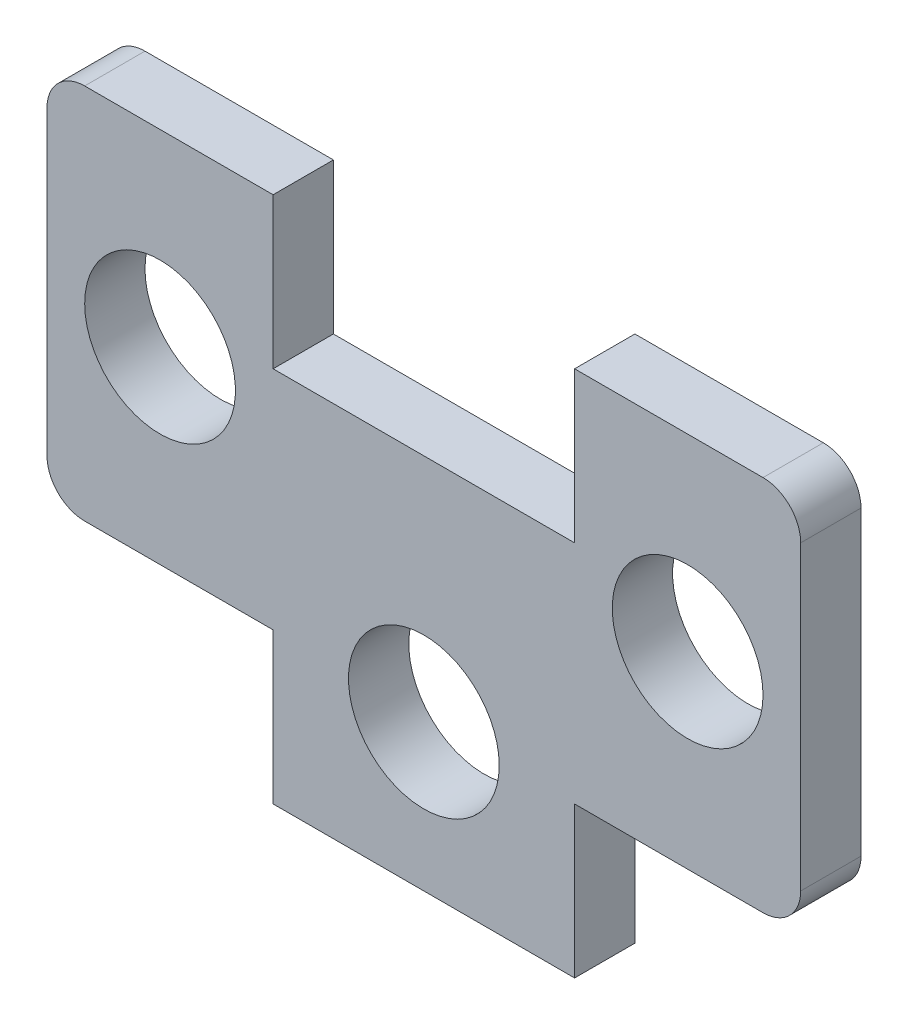
ISO-10303-21;
HEADER;
FILE_DESCRIPTION(('STEP AP214'),'2;1');
FILE_NAME('part.step','',(''),(''),'','','');
FILE_SCHEMA(('AUTOMOTIVE_DESIGN { 1 0 10303 214 1 1 1 1 }'));
ENDSEC;
DATA;
#1=APPLICATION_CONTEXT('core data for automotive mechanical design processes');
#2=APPLICATION_PROTOCOL_DEFINITION('international standard','automotive_design',2000,#1);
#3=PRODUCT_CONTEXT('',#1,'mechanical');
#4=PRODUCT('Part','Part','',(#3));
#5=PRODUCT_RELATED_PRODUCT_CATEGORY('part','',(#4));
#6=PRODUCT_DEFINITION_FORMATION('','',#4);
#7=PRODUCT_DEFINITION_CONTEXT('part definition',#1,'design');
#8=PRODUCT_DEFINITION('design','',#6,#7);
#9=PRODUCT_DEFINITION_SHAPE('','',#8);
#10=(LENGTH_UNIT() NAMED_UNIT(*) SI_UNIT(.MILLI.,.METRE.));
#11=(NAMED_UNIT(*) PLANE_ANGLE_UNIT() SI_UNIT($,.RADIAN.));
#12=(NAMED_UNIT(*) SI_UNIT($,.STERADIAN.) SOLID_ANGLE_UNIT());
#13=UNCERTAINTY_MEASURE_WITH_UNIT(LENGTH_MEASURE(1.E-05),#10,'distance_accuracy_value','');
#14=(GEOMETRIC_REPRESENTATION_CONTEXT(3) GLOBAL_UNCERTAINTY_ASSIGNED_CONTEXT((#13)) GLOBAL_UNIT_ASSIGNED_CONTEXT((#10,
#11,#12)) REPRESENTATION_CONTEXT('',''));
#15=CARTESIAN_POINT('',(0.,0.,0.));
#16=DIRECTION('',(0.,0.,1.));
#17=DIRECTION('',(1.,0.,0.));
#18=AXIS2_PLACEMENT_3D('',#15,#16,#17);
#19=CARTESIAN_POINT('',(225.,-97.0944917097693,40.));
#20=DIRECTION('',(0.,0.,-1.));
#21=DIRECTION('',(-1.,0.,0.));
#22=AXIS2_PLACEMENT_3D('',#19,#20,#21);
#23=PLANE('',#22);
#24=DIRECTION('',(1.,0.,0.));
#25=VECTOR('',#24,1.);
#26=CARTESIAN_POINT('',(-225.,-122.094491709769,40.));
#27=LINE('',#26,#25);
#28=CARTESIAN_POINT('',(-225.,-122.094491709769,40.));
#29=VERTEX_POINT('',#28);
#30=CARTESIAN_POINT('',(-100.,-122.094491709769,40.));
#31=VERTEX_POINT('',#30);
#32=EDGE_CURVE('E209',#29,#31,#27,.T.);
#33=ORIENTED_EDGE('',*,*,#32,.T.);
#34=DIRECTION('',(0.,-1.,0.));
#35=VECTOR('',#34,1.);
#36=CARTESIAN_POINT('',(-100.,-122.094491709769,40.));
#37=LINE('',#36,#35);
#38=CARTESIAN_POINT('',(-100.,-222.094491709769,40.));
#39=VERTEX_POINT('',#38);
#40=EDGE_CURVE('E117',#31,#39,#37,.T.);
#41=ORIENTED_EDGE('',*,*,#40,.T.);
#42=DIRECTION('',(1.,0.,0.));
#43=VECTOR('',#42,1.);
#44=CARTESIAN_POINT('',(-100.,-222.094491709769,40.));
#45=LINE('',#44,#43);
#46=CARTESIAN_POINT('',(99.9999999999999,-222.094491709769,40.));
#47=VERTEX_POINT('',#46);
#48=EDGE_CURVE('E248',#39,#47,#45,.T.);
#49=ORIENTED_EDGE('',*,*,#48,.T.);
#50=DIRECTION('',(0.,1.,0.));
#51=VECTOR('',#50,1.);
#52=CARTESIAN_POINT('',(99.9999999999999,-222.094491709769,40.));
#53=LINE('',#52,#51);
#54=CARTESIAN_POINT('',(99.9999999999999,-122.094491709769,40.));
#55=VERTEX_POINT('',#54);
#56=EDGE_CURVE('E267',#47,#55,#53,.T.);
#57=ORIENTED_EDGE('',*,*,#56,.T.);
#58=DIRECTION('',(1.,0.,0.));
#59=VECTOR('',#58,1.);
#60=CARTESIAN_POINT('',(99.9999999999999,-122.094491709769,40.));
#61=LINE('',#60,#59);
#62=CARTESIAN_POINT('',(225.,-122.094491709769,40.));
#63=VERTEX_POINT('',#62);
#64=EDGE_CURVE('E264',#55,#63,#61,.T.);
#65=ORIENTED_EDGE('',*,*,#64,.T.);
#66=CARTESIAN_POINT('',(225.,-97.0944917097693,40.));
#67=DIRECTION('',(0.,0.,1.));
#68=DIRECTION('',(-1.,0.,0.));
#69=AXIS2_PLACEMENT_3D('',#66,#67,#68);
#70=CIRCLE('',#69,25.);
#71=CARTESIAN_POINT('',(250.,-97.0944917097693,40.));
#72=VERTEX_POINT('',#71);
#73=EDGE_CURVE('E266',#63,#72,#70,.T.);
#74=ORIENTED_EDGE('',*,*,#73,.T.);
#75=DIRECTION('',(0.,1.,0.));
#76=VECTOR('',#75,1.);
#77=CARTESIAN_POINT('',(250.,-97.0944917097693,40.));
#78=LINE('',#77,#76);
#79=CARTESIAN_POINT('',(250.,102.905508290231,40.));
#80=VERTEX_POINT('',#79);
#81=EDGE_CURVE('E269',#72,#80,#78,.T.);
#82=ORIENTED_EDGE('',*,*,#81,.T.);
#83=CARTESIAN_POINT('',(225.,102.905508290231,40.));
#84=DIRECTION('',(0.,0.,1.));
#85=DIRECTION('',(1.,0.,0.));
#86=AXIS2_PLACEMENT_3D('',#83,#84,#85);
#87=CIRCLE('',#86,25.);
#88=CARTESIAN_POINT('',(225.,127.905508290231,40.));
#89=VERTEX_POINT('',#88);
#90=EDGE_CURVE('E275',#80,#89,#87,.T.);
#91=ORIENTED_EDGE('',*,*,#90,.T.);
#92=DIRECTION('',(-1.,0.,0.));
#93=VECTOR('',#92,1.);
#94=CARTESIAN_POINT('',(99.9999999999999,127.905508290231,40.));
#95=LINE('',#94,#93);
#96=CARTESIAN_POINT('',(99.9999999999999,127.905508290231,40.));
#97=VERTEX_POINT('',#96);
#98=EDGE_CURVE('E277',#89,#97,#95,.T.);
#99=ORIENTED_EDGE('',*,*,#98,.T.);
#100=DIRECTION('',(0.,-1.,0.));
#101=VECTOR('',#100,1.);
#102=CARTESIAN_POINT('',(100.,27.9055082902306,40.));
#103=LINE('',#102,#101);
#104=CARTESIAN_POINT('',(100.,27.9055082902306,40.));
#105=VERTEX_POINT('',#104);
#106=EDGE_CURVE('E279',#97,#105,#103,.T.);
#107=ORIENTED_EDGE('',*,*,#106,.T.);
#108=DIRECTION('',(-1.,0.,0.));
#109=VECTOR('',#108,1.);
#110=CARTESIAN_POINT('',(-100.,27.9055082902306,40.));
#111=LINE('',#110,#109);
#112=CARTESIAN_POINT('',(-100.,27.9055082902306,40.));
#113=VERTEX_POINT('',#112);
#114=EDGE_CURVE('E281',#105,#113,#111,.T.);
#115=ORIENTED_EDGE('',*,*,#114,.T.);
#116=DIRECTION('',(0.,1.,0.));
#117=VECTOR('',#116,1.);
#118=CARTESIAN_POINT('',(-100.,127.905508290231,40.));
#119=LINE('',#118,#117);
#120=CARTESIAN_POINT('',(-100.,127.905508290231,40.));
#121=VERTEX_POINT('',#120);
#122=EDGE_CURVE('E283',#113,#121,#119,.T.);
#123=ORIENTED_EDGE('',*,*,#122,.T.);
#124=DIRECTION('',(-1.,0.,0.));
#125=VECTOR('',#124,1.);
#126=CARTESIAN_POINT('',(-225.,127.905508290231,40.));
#127=LINE('',#126,#125);
#128=CARTESIAN_POINT('',(-225.,127.905508290231,40.));
#129=VERTEX_POINT('',#128);
#130=EDGE_CURVE('E160',#121,#129,#127,.T.);
#131=ORIENTED_EDGE('',*,*,#130,.T.);
#132=CARTESIAN_POINT('',(-225.,102.905508290231,40.));
#133=DIRECTION('',(0.,0.,1.));
#134=DIRECTION('',(-1.,0.,0.));
#135=AXIS2_PLACEMENT_3D('',#132,#133,#134);
#136=CIRCLE('',#135,25.);
#137=CARTESIAN_POINT('',(-250.,102.905508290231,40.));
#138=VERTEX_POINT('',#137);
#139=EDGE_CURVE('E154',#129,#138,#136,.T.);
#140=ORIENTED_EDGE('',*,*,#139,.T.);
#141=DIRECTION('',(0.,-1.,0.));
#142=VECTOR('',#141,1.);
#143=CARTESIAN_POINT('',(-250.,-97.0944917097693,40.));
#144=LINE('',#143,#142);
#145=CARTESIAN_POINT('',(-250.,-97.0944917097693,40.));
#146=VERTEX_POINT('',#145);
#147=EDGE_CURVE('E158',#138,#146,#144,.T.);
#148=ORIENTED_EDGE('',*,*,#147,.T.);
#149=CARTESIAN_POINT('',(-225.,-97.0944917097693,40.));
#150=DIRECTION('',(0.,0.,1.));
#151=DIRECTION('',(-1.,0.,0.));
#152=AXIS2_PLACEMENT_3D('',#149,#150,#151);
#153=CIRCLE('',#152,25.);
#154=EDGE_CURVE('E50',#146,#29,#153,.T.);
#155=ORIENTED_EDGE('',*,*,#154,.T.);
#156=EDGE_LOOP('',(#33,#41,#49,#57,#65,#74,#82,#91,#99,#107,#115,#123,#131,#140,#148,#155));
#157=FACE_BOUND('',#156,.T.);
#158=CARTESIAN_POINT('',(0.,-125.,40.));
#159=DIRECTION('',(0.,0.,1.));
#160=DIRECTION('',(1.,0.,0.));
#161=AXIS2_PLACEMENT_3D('',#158,#159,#160);
#162=CIRCLE('',#161,50.);
#163=CARTESIAN_POINT('',(50.,-125.,40.));
#164=VERTEX_POINT('',#163);
#165=EDGE_CURVE('E182',#164,#164,#162,.T.);
#166=ORIENTED_EDGE('',*,*,#165,.F.);
#167=EDGE_LOOP('',(#166));
#168=FACE_BOUND('',#167,.T.);
#169=CARTESIAN_POINT('',(175.,2.90550829023069,40.));
#170=DIRECTION('',(0.,0.,1.));
#171=DIRECTION('',(1.,0.,0.));
#172=AXIS2_PLACEMENT_3D('',#169,#170,#171);
#173=CIRCLE('',#172,50.);
#174=CARTESIAN_POINT('',(225.,2.90550829023069,40.));
#175=VERTEX_POINT('',#174);
#176=EDGE_CURVE('E337',#175,#175,#173,.T.);
#177=ORIENTED_EDGE('',*,*,#176,.F.);
#178=EDGE_LOOP('',(#177));
#179=FACE_BOUND('',#178,.T.);
#180=CARTESIAN_POINT('',(-175.,2.90550829023069,40.));
#181=DIRECTION('',(0.,0.,1.));
#182=DIRECTION('',(-1.,0.,0.));
#183=AXIS2_PLACEMENT_3D('',#180,#181,#182);
#184=CIRCLE('',#183,50.);
#185=CARTESIAN_POINT('',(-225.,2.90550829023069,40.));
#186=VERTEX_POINT('',#185);
#187=EDGE_CURVE('E328',#186,#186,#184,.T.);
#188=ORIENTED_EDGE('',*,*,#187,.F.);
#189=EDGE_LOOP('',(#188));
#190=FACE_BOUND('',#189,.T.);
#191=ADVANCED_FACE('F33',(#157,#168,#179,#190),#23,.F.);
#192=CARTESIAN_POINT('',(225.,-97.0944917097693,0.));
#193=DIRECTION('',(0.,0.,-1.));
#194=DIRECTION('',(-1.,0.,0.));
#195=AXIS2_PLACEMENT_3D('',#192,#193,#194);
#196=PLANE('',#195);
#197=CARTESIAN_POINT('',(175.,2.90550829023069,0.));
#198=DIRECTION('',(0.,0.,1.));
#199=DIRECTION('',(1.,0.,0.));
#200=AXIS2_PLACEMENT_3D('',#197,#198,#199);
#201=CIRCLE('',#200,50.);
#202=CARTESIAN_POINT('',(225.,2.90550829023069,0.));
#203=VERTEX_POINT('',#202);
#204=EDGE_CURVE('E334',#203,#203,#201,.T.);
#205=ORIENTED_EDGE('',*,*,#204,.T.);
#206=EDGE_LOOP('',(#205));
#207=FACE_BOUND('',#206,.T.);
#208=DIRECTION('',(1.,0.,0.));
#209=VECTOR('',#208,1.);
#210=CARTESIAN_POINT('',(-225.,-122.094491709769,0.));
#211=LINE('',#210,#209);
#212=CARTESIAN_POINT('',(-225.,-122.094491709769,0.));
#213=VERTEX_POINT('',#212);
#214=CARTESIAN_POINT('',(-100.,-122.094491709769,0.));
#215=VERTEX_POINT('',#214);
#216=EDGE_CURVE('E178',#213,#215,#211,.T.);
#217=ORIENTED_EDGE('',*,*,#216,.F.);
#218=CARTESIAN_POINT('',(-225.,-97.0944917097693,0.));
#219=DIRECTION('',(0.,0.,1.));
#220=DIRECTION('',(-1.,0.,0.));
#221=AXIS2_PLACEMENT_3D('',#218,#219,#220);
#222=CIRCLE('',#221,25.);
#223=CARTESIAN_POINT('',(-250.,-97.0944917097693,0.));
#224=VERTEX_POINT('',#223);
#225=EDGE_CURVE('E109',#224,#213,#222,.T.);
#226=ORIENTED_EDGE('',*,*,#225,.F.);
#227=DIRECTION('',(0.,-1.,0.));
#228=VECTOR('',#227,1.);
#229=CARTESIAN_POINT('',(-250.,-97.0944917097693,0.));
#230=LINE('',#229,#228);
#231=CARTESIAN_POINT('',(-250.,102.905508290231,0.));
#232=VERTEX_POINT('',#231);
#233=EDGE_CURVE('E103',#232,#224,#230,.T.);
#234=ORIENTED_EDGE('',*,*,#233,.F.);
#235=CARTESIAN_POINT('',(-225.,102.905508290231,0.));
#236=DIRECTION('',(0.,0.,1.));
#237=DIRECTION('',(-1.,0.,0.));
#238=AXIS2_PLACEMENT_3D('',#235,#236,#237);
#239=CIRCLE('',#238,25.);
#240=CARTESIAN_POINT('',(-225.,127.905508290231,0.));
#241=VERTEX_POINT('',#240);
#242=EDGE_CURVE('E168',#241,#232,#239,.T.);
#243=ORIENTED_EDGE('',*,*,#242,.F.);
#244=DIRECTION('',(-1.,0.,0.));
#245=VECTOR('',#244,1.);
#246=CARTESIAN_POINT('',(-225.,127.905508290231,0.));
#247=LINE('',#246,#245);
#248=CARTESIAN_POINT('',(-100.,127.905508290231,0.));
#249=VERTEX_POINT('',#248);
#250=EDGE_CURVE('E204',#249,#241,#247,.T.);
#251=ORIENTED_EDGE('',*,*,#250,.F.);
#252=DIRECTION('',(0.,1.,0.));
#253=VECTOR('',#252,1.);
#254=CARTESIAN_POINT('',(-100.,127.905508290231,0.));
#255=LINE('',#254,#253);
#256=CARTESIAN_POINT('',(-100.,27.9055082902306,0.));
#257=VERTEX_POINT('',#256);
#258=EDGE_CURVE('E202',#257,#249,#255,.T.);
#259=ORIENTED_EDGE('',*,*,#258,.F.);
#260=DIRECTION('',(-1.,0.,0.));
#261=VECTOR('',#260,1.);
#262=CARTESIAN_POINT('',(-100.,27.9055082902306,0.));
#263=LINE('',#262,#261);
#264=CARTESIAN_POINT('',(100.,27.9055082902306,0.));
#265=VERTEX_POINT('',#264);
#266=EDGE_CURVE('E200',#265,#257,#263,.T.);
#267=ORIENTED_EDGE('',*,*,#266,.F.);
#268=DIRECTION('',(0.,-1.,0.));
#269=VECTOR('',#268,1.);
#270=CARTESIAN_POINT('',(100.,27.9055082902306,0.));
#271=LINE('',#270,#269);
#272=CARTESIAN_POINT('',(99.9999999999999,127.905508290231,0.));
#273=VERTEX_POINT('',#272);
#274=EDGE_CURVE('E198',#273,#265,#271,.T.);
#275=ORIENTED_EDGE('',*,*,#274,.F.);
#276=DIRECTION('',(-1.,0.,0.));
#277=VECTOR('',#276,1.);
#278=CARTESIAN_POINT('',(99.9999999999999,127.905508290231,0.));
#279=LINE('',#278,#277);
#280=CARTESIAN_POINT('',(225.,127.905508290231,0.));
#281=VERTEX_POINT('',#280);
#282=EDGE_CURVE('E196',#281,#273,#279,.T.);
#283=ORIENTED_EDGE('',*,*,#282,.F.);
#284=CARTESIAN_POINT('',(225.,102.905508290231,0.));
#285=DIRECTION('',(0.,0.,1.));
#286=DIRECTION('',(1.,0.,0.));
#287=AXIS2_PLACEMENT_3D('',#284,#285,#286);
#288=CIRCLE('',#287,25.);
#289=CARTESIAN_POINT('',(250.,102.905508290231,0.));
#290=VERTEX_POINT('',#289);
#291=EDGE_CURVE('E194',#290,#281,#288,.T.);
#292=ORIENTED_EDGE('',*,*,#291,.F.);
#293=DIRECTION('',(0.,1.,0.));
#294=VECTOR('',#293,1.);
#295=CARTESIAN_POINT('',(250.,-97.0944917097693,0.));
#296=LINE('',#295,#294);
#297=CARTESIAN_POINT('',(250.,-97.0944917097693,0.));
#298=VERTEX_POINT('',#297);
#299=EDGE_CURVE('E192',#298,#290,#296,.T.);
#300=ORIENTED_EDGE('',*,*,#299,.F.);
#301=CARTESIAN_POINT('',(225.,-97.0944917097693,0.));
#302=DIRECTION('',(0.,0.,1.));
#303=DIRECTION('',(-1.,0.,0.));
#304=AXIS2_PLACEMENT_3D('',#301,#302,#303);
#305=CIRCLE('',#304,25.);
#306=CARTESIAN_POINT('',(225.,-122.094491709769,0.));
#307=VERTEX_POINT('',#306);
#308=EDGE_CURVE('E190',#307,#298,#305,.T.);
#309=ORIENTED_EDGE('',*,*,#308,.F.);
#310=DIRECTION('',(1.,0.,0.));
#311=VECTOR('',#310,1.);
#312=CARTESIAN_POINT('',(99.9999999999999,-122.094491709769,0.));
#313=LINE('',#312,#311);
#314=CARTESIAN_POINT('',(99.9999999999999,-122.094491709769,0.));
#315=VERTEX_POINT('',#314);
#316=EDGE_CURVE('E188',#315,#307,#313,.T.);
#317=ORIENTED_EDGE('',*,*,#316,.F.);
#318=DIRECTION('',(0.,1.,0.));
#319=VECTOR('',#318,1.);
#320=CARTESIAN_POINT('',(99.9999999999999,-222.094491709769,0.));
#321=LINE('',#320,#319);
#322=CARTESIAN_POINT('',(99.9999999999999,-222.094491709769,0.));
#323=VERTEX_POINT('',#322);
#324=EDGE_CURVE('E186',#323,#315,#321,.T.);
#325=ORIENTED_EDGE('',*,*,#324,.F.);
#326=DIRECTION('',(1.,0.,0.));
#327=VECTOR('',#326,1.);
#328=CARTESIAN_POINT('',(-100.,-222.094491709769,0.));
#329=LINE('',#328,#327);
#330=CARTESIAN_POINT('',(-100.,-222.094491709769,0.));
#331=VERTEX_POINT('',#330);
#332=EDGE_CURVE('E184',#331,#323,#329,.T.);
#333=ORIENTED_EDGE('',*,*,#332,.F.);
#334=DIRECTION('',(0.,-1.,0.));
#335=VECTOR('',#334,1.);
#336=CARTESIAN_POINT('',(-100.,-122.094491709769,0.));
#337=LINE('',#336,#335);
#338=EDGE_CURVE('E181',#215,#331,#337,.T.);
#339=ORIENTED_EDGE('',*,*,#338,.F.);
#340=EDGE_LOOP('',(#217,#226,#234,#243,#251,#259,#267,#275,#283,#292,#300,#309,#317,#325,#333,#339));
#341=FACE_BOUND('',#340,.T.);
#342=CARTESIAN_POINT('',(0.,-125.,0.));
#343=DIRECTION('',(0.,0.,1.));
#344=DIRECTION('',(1.,0.,0.));
#345=AXIS2_PLACEMENT_3D('',#342,#343,#344);
#346=CIRCLE('',#345,50.);
#347=CARTESIAN_POINT('',(50.,-125.,0.));
#348=VERTEX_POINT('',#347);
#349=EDGE_CURVE('E340',#348,#348,#346,.T.);
#350=ORIENTED_EDGE('',*,*,#349,.T.);
#351=EDGE_LOOP('',(#350));
#352=FACE_BOUND('',#351,.T.);
#353=CARTESIAN_POINT('',(-175.,2.90550829023069,0.));
#354=DIRECTION('',(0.,0.,1.));
#355=DIRECTION('',(-1.,0.,0.));
#356=AXIS2_PLACEMENT_3D('',#353,#354,#355);
#357=CIRCLE('',#356,50.);
#358=CARTESIAN_POINT('',(-225.,2.90550829023069,0.));
#359=VERTEX_POINT('',#358);
#360=EDGE_CURVE('E331',#359,#359,#357,.T.);
#361=ORIENTED_EDGE('',*,*,#360,.T.);
#362=EDGE_LOOP('',(#361));
#363=FACE_BOUND('',#362,.T.);
#364=ADVANCED_FACE('F252',(#207,#341,#352,#363),#196,.T.);
#365=CARTESIAN_POINT('',(-225.,-122.094491709769,40.));
#366=DIRECTION('',(0.,1.,0.));
#367=DIRECTION('',(0.,0.,1.));
#368=AXIS2_PLACEMENT_3D('',#365,#366,#367);
#369=PLANE('',#368);
#370=ORIENTED_EDGE('',*,*,#216,.T.);
#371=DIRECTION('',(0.,0.,-1.));
#372=VECTOR('',#371,1.);
#373=CARTESIAN_POINT('',(-100.,-122.094491709769,40.));
#374=LINE('',#373,#372);
#375=EDGE_CURVE('E11',#31,#215,#374,.T.);
#376=ORIENTED_EDGE('',*,*,#375,.F.);
#377=ORIENTED_EDGE('',*,*,#32,.F.);
#378=DIRECTION('',(0.,0.,-1.));
#379=VECTOR('',#378,1.);
#380=CARTESIAN_POINT('',(-225.,-122.094491709769,40.));
#381=LINE('',#380,#379);
#382=EDGE_CURVE('E174',#29,#213,#381,.T.);
#383=ORIENTED_EDGE('',*,*,#382,.T.);
#384=EDGE_LOOP('',(#370,#376,#377,#383));
#385=FACE_BOUND('',#384,.T.);
#386=ADVANCED_FACE('F35',(#385),#369,.F.);
#387=CARTESIAN_POINT('',(-100.,-122.094491709769,40.));
#388=DIRECTION('',(1.,0.,0.));
#389=DIRECTION('',(0.,1.,0.));
#390=AXIS2_PLACEMENT_3D('',#387,#388,#389);
#391=PLANE('',#390);
#392=ORIENTED_EDGE('',*,*,#338,.T.);
#393=DIRECTION('',(0.,0.,-1.));
#394=VECTOR('',#393,1.);
#395=CARTESIAN_POINT('',(-100.,-222.094491709769,40.));
#396=LINE('',#395,#394);
#397=EDGE_CURVE('E42',#39,#331,#396,.T.);
#398=ORIENTED_EDGE('',*,*,#397,.F.);
#399=ORIENTED_EDGE('',*,*,#40,.F.);
#400=ORIENTED_EDGE('',*,*,#375,.T.);
#401=EDGE_LOOP('',(#392,#398,#399,#400));
#402=FACE_BOUND('',#401,.T.);
#403=ADVANCED_FACE('F483',(#402),#391,.F.);
#404=CARTESIAN_POINT('',(-100.,-222.094491709769,40.));
#405=DIRECTION('',(0.,1.,0.));
#406=DIRECTION('',(0.,0.,1.));
#407=AXIS2_PLACEMENT_3D('',#404,#405,#406);
#408=PLANE('',#407);
#409=ORIENTED_EDGE('',*,*,#332,.T.);
#410=DIRECTION('',(0.,0.,-1.));
#411=VECTOR('',#410,1.);
#412=CARTESIAN_POINT('',(99.9999999999999,-222.094491709769,40.));
#413=LINE('',#412,#411);
#414=EDGE_CURVE('E240',#47,#323,#413,.T.);
#415=ORIENTED_EDGE('',*,*,#414,.F.);
#416=ORIENTED_EDGE('',*,*,#48,.F.);
#417=ORIENTED_EDGE('',*,*,#397,.T.);
#418=EDGE_LOOP('',(#409,#415,#416,#417));
#419=FACE_BOUND('',#418,.T.);
#420=ADVANCED_FACE('F246',(#419),#408,.F.);
#421=CARTESIAN_POINT('',(99.9999999999999,-222.094491709769,40.));
#422=DIRECTION('',(-1.,0.,0.));
#423=DIRECTION('',(0.,-1.,0.));
#424=AXIS2_PLACEMENT_3D('',#421,#422,#423);
#425=PLANE('',#424);
#426=ORIENTED_EDGE('',*,*,#324,.T.);
#427=DIRECTION('',(0.,0.,-1.));
#428=VECTOR('',#427,1.);
#429=CARTESIAN_POINT('',(99.9999999999999,-122.094491709769,40.));
#430=LINE('',#429,#428);
#431=EDGE_CURVE('E237',#55,#315,#430,.T.);
#432=ORIENTED_EDGE('',*,*,#431,.F.);
#433=ORIENTED_EDGE('',*,*,#56,.F.);
#434=ORIENTED_EDGE('',*,*,#414,.T.);
#435=EDGE_LOOP('',(#426,#432,#433,#434));
#436=FACE_BOUND('',#435,.T.);
#437=ADVANCED_FACE('F258',(#436),#425,.F.);
#438=CARTESIAN_POINT('',(99.9999999999999,-122.094491709769,40.));
#439=DIRECTION('',(0.,1.,0.));
#440=DIRECTION('',(0.,0.,1.));
#441=AXIS2_PLACEMENT_3D('',#438,#439,#440);
#442=PLANE('',#441);
#443=ORIENTED_EDGE('',*,*,#316,.T.);
#444=DIRECTION('',(0.,0.,-1.));
#445=VECTOR('',#444,1.);
#446=CARTESIAN_POINT('',(225.,-122.094491709769,40.));
#447=LINE('',#446,#445);
#448=EDGE_CURVE('E234',#63,#307,#447,.T.);
#449=ORIENTED_EDGE('',*,*,#448,.F.);
#450=ORIENTED_EDGE('',*,*,#64,.F.);
#451=ORIENTED_EDGE('',*,*,#431,.T.);
#452=EDGE_LOOP('',(#443,#449,#450,#451));
#453=FACE_BOUND('',#452,.T.);
#454=ADVANCED_FACE('F262',(#453),#442,.F.);
#455=CARTESIAN_POINT('',(225.,-97.0944917097693,40.));
#456=DIRECTION('',(0.,0.,-1.));
#457=DIRECTION('',(-1.,0.,0.));
#458=AXIS2_PLACEMENT_3D('',#455,#456,#457);
#459=CYLINDRICAL_SURFACE('',#458,25.);
#460=ORIENTED_EDGE('',*,*,#308,.T.);
#461=DIRECTION('',(0.,0.,-1.));
#462=VECTOR('',#461,1.);
#463=CARTESIAN_POINT('',(250.,-97.0944917097693,40.));
#464=LINE('',#463,#462);
#465=EDGE_CURVE('E231',#72,#298,#464,.T.);
#466=ORIENTED_EDGE('',*,*,#465,.F.);
#467=ORIENTED_EDGE('',*,*,#73,.F.);
#468=ORIENTED_EDGE('',*,*,#448,.T.);
#469=EDGE_LOOP('',(#460,#466,#467,#468));
#470=FACE_BOUND('',#469,.T.);
#471=ADVANCED_FACE('F448',(#470),#459,.T.);
#472=CARTESIAN_POINT('',(250.,-97.0944917097693,40.));
#473=DIRECTION('',(-1.,0.,0.));
#474=DIRECTION('',(0.,0.,1.));
#475=AXIS2_PLACEMENT_3D('',#472,#473,#474);
#476=PLANE('',#475);
#477=ORIENTED_EDGE('',*,*,#299,.T.);
#478=DIRECTION('',(0.,0.,-1.));
#479=VECTOR('',#478,1.);
#480=CARTESIAN_POINT('',(250.,102.905508290231,40.));
#481=LINE('',#480,#479);
#482=EDGE_CURVE('E228',#80,#290,#481,.T.);
#483=ORIENTED_EDGE('',*,*,#482,.F.);
#484=ORIENTED_EDGE('',*,*,#81,.F.);
#485=ORIENTED_EDGE('',*,*,#465,.T.);
#486=EDGE_LOOP('',(#477,#483,#484,#485));
#487=FACE_BOUND('',#486,.T.);
#488=ADVANCED_FACE('F438',(#487),#476,.F.);
#489=CARTESIAN_POINT('',(225.,102.905508290231,40.));
#490=DIRECTION('',(0.,0.,-1.));
#491=DIRECTION('',(-1.,0.,0.));
#492=AXIS2_PLACEMENT_3D('',#489,#490,#491);
#493=CYLINDRICAL_SURFACE('',#492,25.);
#494=ORIENTED_EDGE('',*,*,#291,.T.);
#495=DIRECTION('',(0.,0.,-1.));
#496=VECTOR('',#495,1.);
#497=CARTESIAN_POINT('',(225.,127.905508290231,40.));
#498=LINE('',#497,#496);
#499=EDGE_CURVE('E225',#89,#281,#498,.T.);
#500=ORIENTED_EDGE('',*,*,#499,.F.);
#501=ORIENTED_EDGE('',*,*,#90,.F.);
#502=ORIENTED_EDGE('',*,*,#482,.T.);
#503=EDGE_LOOP('',(#494,#500,#501,#502));
#504=FACE_BOUND('',#503,.T.);
#505=ADVANCED_FACE('F428',(#504),#493,.T.);
#506=CARTESIAN_POINT('',(99.9999999999999,127.905508290231,40.));
#507=DIRECTION('',(0.,-1.,0.));
#508=DIRECTION('',(0.,0.,-1.));
#509=AXIS2_PLACEMENT_3D('',#506,#507,#508);
#510=PLANE('',#509);
#511=ORIENTED_EDGE('',*,*,#282,.T.);
#512=DIRECTION('',(0.,0.,-1.));
#513=VECTOR('',#512,1.);
#514=CARTESIAN_POINT('',(99.9999999999999,127.905508290231,40.));
#515=LINE('',#514,#513);
#516=EDGE_CURVE('E222',#97,#273,#515,.T.);
#517=ORIENTED_EDGE('',*,*,#516,.F.);
#518=ORIENTED_EDGE('',*,*,#98,.F.);
#519=ORIENTED_EDGE('',*,*,#499,.T.);
#520=EDGE_LOOP('',(#511,#517,#518,#519));
#521=FACE_BOUND('',#520,.T.);
#522=ADVANCED_FACE('F418',(#521),#510,.F.);
#523=CARTESIAN_POINT('',(100.,27.9055082902306,40.));
#524=DIRECTION('',(1.,0.,0.));
#525=DIRECTION('',(0.,1.,0.));
#526=AXIS2_PLACEMENT_3D('',#523,#524,#525);
#527=PLANE('',#526);
#528=ORIENTED_EDGE('',*,*,#274,.T.);
#529=DIRECTION('',(0.,0.,-1.));
#530=VECTOR('',#529,1.);
#531=CARTESIAN_POINT('',(100.,27.9055082902306,40.));
#532=LINE('',#531,#530);
#533=EDGE_CURVE('E219',#105,#265,#532,.T.);
#534=ORIENTED_EDGE('',*,*,#533,.F.);
#535=ORIENTED_EDGE('',*,*,#106,.F.);
#536=ORIENTED_EDGE('',*,*,#516,.T.);
#537=EDGE_LOOP('',(#528,#534,#535,#536));
#538=FACE_BOUND('',#537,.T.);
#539=ADVANCED_FACE('F408',(#538),#527,.F.);
#540=CARTESIAN_POINT('',(-100.,27.9055082902306,40.));
#541=DIRECTION('',(0.,-1.,0.));
#542=DIRECTION('',(0.,0.,-1.));
#543=AXIS2_PLACEMENT_3D('',#540,#541,#542);
#544=PLANE('',#543);
#545=ORIENTED_EDGE('',*,*,#266,.T.);
#546=DIRECTION('',(0.,0.,-1.));
#547=VECTOR('',#546,1.);
#548=CARTESIAN_POINT('',(-100.,27.9055082902306,40.));
#549=LINE('',#548,#547);
#550=EDGE_CURVE('E216',#113,#257,#549,.T.);
#551=ORIENTED_EDGE('',*,*,#550,.F.);
#552=ORIENTED_EDGE('',*,*,#114,.F.);
#553=ORIENTED_EDGE('',*,*,#533,.T.);
#554=EDGE_LOOP('',(#545,#551,#552,#553));
#555=FACE_BOUND('',#554,.T.);
#556=ADVANCED_FACE('F399',(#555),#544,.F.);
#557=CARTESIAN_POINT('',(-100.,127.905508290231,40.));
#558=DIRECTION('',(-1.,0.,0.));
#559=DIRECTION('',(0.,-1.,0.));
#560=AXIS2_PLACEMENT_3D('',#557,#558,#559);
#561=PLANE('',#560);
#562=ORIENTED_EDGE('',*,*,#258,.T.);
#563=DIRECTION('',(0.,0.,-1.));
#564=VECTOR('',#563,1.);
#565=CARTESIAN_POINT('',(-100.,127.905508290231,40.));
#566=LINE('',#565,#564);
#567=EDGE_CURVE('E213',#121,#249,#566,.T.);
#568=ORIENTED_EDGE('',*,*,#567,.F.);
#569=ORIENTED_EDGE('',*,*,#122,.F.);
#570=ORIENTED_EDGE('',*,*,#550,.T.);
#571=EDGE_LOOP('',(#562,#568,#569,#570));
#572=FACE_BOUND('',#571,.T.);
#573=ADVANCED_FACE('F289',(#572),#561,.F.);
#574=CARTESIAN_POINT('',(-225.,127.905508290231,40.));
#575=DIRECTION('',(0.,-1.,0.));
#576=DIRECTION('',(0.,0.,-1.));
#577=AXIS2_PLACEMENT_3D('',#574,#575,#576);
#578=PLANE('',#577);
#579=ORIENTED_EDGE('',*,*,#250,.T.);
#580=DIRECTION('',(0.,0.,-1.));
#581=VECTOR('',#580,1.);
#582=CARTESIAN_POINT('',(-225.,127.905508290231,40.));
#583=LINE('',#582,#581);
#584=EDGE_CURVE('E169',#129,#241,#583,.T.);
#585=ORIENTED_EDGE('',*,*,#584,.F.);
#586=ORIENTED_EDGE('',*,*,#130,.F.);
#587=ORIENTED_EDGE('',*,*,#567,.T.);
#588=EDGE_LOOP('',(#579,#585,#586,#587));
#589=FACE_BOUND('',#588,.T.);
#590=ADVANCED_FACE('F293',(#589),#578,.F.);
#591=CARTESIAN_POINT('',(-225.,102.905508290231,40.));
#592=DIRECTION('',(0.,0.,-1.));
#593=DIRECTION('',(-1.,0.,0.));
#594=AXIS2_PLACEMENT_3D('',#591,#592,#593);
#595=CYLINDRICAL_SURFACE('',#594,25.);
#596=ORIENTED_EDGE('',*,*,#242,.T.);
#597=DIRECTION('',(0.,0.,-1.));
#598=VECTOR('',#597,1.);
#599=CARTESIAN_POINT('',(-250.,102.905508290231,40.));
#600=LINE('',#599,#598);
#601=EDGE_CURVE('E165',#138,#232,#600,.T.);
#602=ORIENTED_EDGE('',*,*,#601,.F.);
#603=ORIENTED_EDGE('',*,*,#139,.F.);
#604=ORIENTED_EDGE('',*,*,#584,.T.);
#605=EDGE_LOOP('',(#596,#602,#603,#604));
#606=FACE_BOUND('',#605,.T.);
#607=ADVANCED_FACE('F166',(#606),#595,.T.);
#608=CARTESIAN_POINT('',(-250.,-97.0944917097693,40.));
#609=DIRECTION('',(1.,0.,0.));
#610=DIRECTION('',(0.,0.,-1.));
#611=AXIS2_PLACEMENT_3D('',#608,#609,#610);
#612=PLANE('',#611);
#613=ORIENTED_EDGE('',*,*,#233,.T.);
#614=DIRECTION('',(0.,0.,-1.));
#615=VECTOR('',#614,1.);
#616=CARTESIAN_POINT('',(-250.,-97.0944917097693,40.));
#617=LINE('',#616,#615);
#618=EDGE_CURVE('E170',#146,#224,#617,.T.);
#619=ORIENTED_EDGE('',*,*,#618,.F.);
#620=ORIENTED_EDGE('',*,*,#147,.F.);
#621=ORIENTED_EDGE('',*,*,#601,.T.);
#622=EDGE_LOOP('',(#613,#619,#620,#621));
#623=FACE_BOUND('',#622,.T.);
#624=ADVANCED_FACE('F172',(#623),#612,.F.);
#625=CARTESIAN_POINT('',(-225.,-97.0944917097693,40.));
#626=DIRECTION('',(0.,0.,-1.));
#627=DIRECTION('',(-1.,0.,0.));
#628=AXIS2_PLACEMENT_3D('',#625,#626,#627);
#629=CYLINDRICAL_SURFACE('',#628,25.);
#630=ORIENTED_EDGE('',*,*,#225,.T.);
#631=ORIENTED_EDGE('',*,*,#382,.F.);
#632=ORIENTED_EDGE('',*,*,#154,.F.);
#633=ORIENTED_EDGE('',*,*,#618,.T.);
#634=EDGE_LOOP('',(#630,#631,#632,#633));
#635=FACE_BOUND('',#634,.T.);
#636=ADVANCED_FACE('F297',(#635),#629,.T.);
#637=CARTESIAN_POINT('',(0.,-125.,40.));
#638=DIRECTION('',(0.,0.,-1.));
#639=DIRECTION('',(-1.,0.,0.));
#640=AXIS2_PLACEMENT_3D('',#637,#638,#639);
#641=CYLINDRICAL_SURFACE('',#640,50.);
#642=ORIENTED_EDGE('',*,*,#165,.T.);
#643=EDGE_LOOP('',(#642));
#644=FACE_BOUND('',#643,.T.);
#645=ORIENTED_EDGE('',*,*,#349,.F.);
#646=EDGE_LOOP('',(#645));
#647=FACE_BOUND('',#646,.T.);
#648=ADVANCED_FACE('F299',(#644,#647),#641,.F.);
#649=CARTESIAN_POINT('',(175.,2.90550829023069,40.));
#650=DIRECTION('',(0.,0.,-1.));
#651=DIRECTION('',(-1.,0.,0.));
#652=AXIS2_PLACEMENT_3D('',#649,#650,#651);
#653=CYLINDRICAL_SURFACE('',#652,50.);
#654=ORIENTED_EDGE('',*,*,#176,.T.);
#655=EDGE_LOOP('',(#654));
#656=FACE_BOUND('',#655,.T.);
#657=ORIENTED_EDGE('',*,*,#204,.F.);
#658=EDGE_LOOP('',(#657));
#659=FACE_BOUND('',#658,.T.);
#660=ADVANCED_FACE('F305',(#656,#659),#653,.F.);
#661=CARTESIAN_POINT('',(-175.,2.90550829023069,40.));
#662=DIRECTION('',(0.,0.,-1.));
#663=DIRECTION('',(-1.,0.,0.));
#664=AXIS2_PLACEMENT_3D('',#661,#662,#663);
#665=CYLINDRICAL_SURFACE('',#664,50.);
#666=ORIENTED_EDGE('',*,*,#187,.T.);
#667=EDGE_LOOP('',(#666));
#668=FACE_BOUND('',#667,.T.);
#669=ORIENTED_EDGE('',*,*,#360,.F.);
#670=EDGE_LOOP('',(#669));
#671=FACE_BOUND('',#670,.T.);
#672=ADVANCED_FACE('F319',(#668,#671),#665,.F.);
#673=CLOSED_SHELL('',(#191,#364,#386,#403,#420,#437,#454,#471,#488,#505,#522,#539,#556,#573,
#590,#607,#624,#636,#648,#660,#672));
#674=MANIFOLD_SOLID_BREP('B2',#673);
#675=ADVANCED_BREP_SHAPE_REPRESENTATION('',(#18,#674),#14);
#676=SHAPE_DEFINITION_REPRESENTATION(#9,#675);
ENDSEC;
END-ISO-10303-21;
